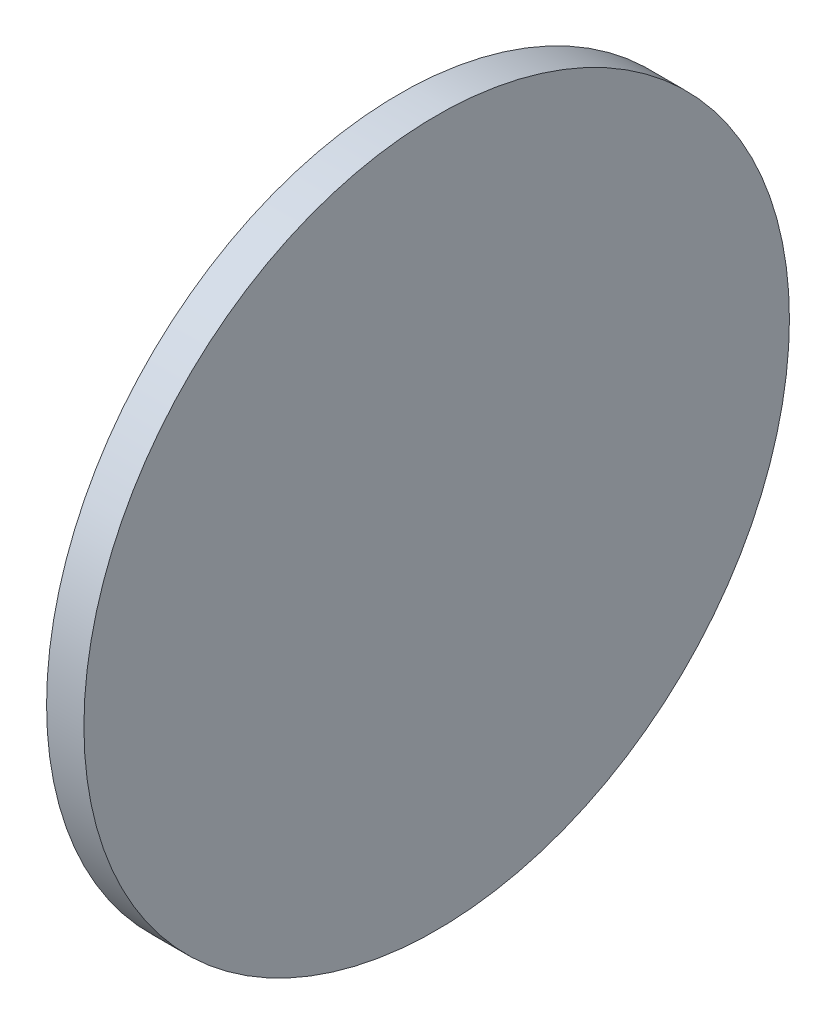
ISO-10303-21;
HEADER;
FILE_DESCRIPTION(('STEP AP214'),'2;1');
FILE_NAME('part.step','',(''),(''),'','','');
FILE_SCHEMA(('AUTOMOTIVE_DESIGN { 1 0 10303 214 1 1 1 1 }'));
ENDSEC;
DATA;
#1=APPLICATION_CONTEXT('core data for automotive mechanical design processes');
#2=APPLICATION_PROTOCOL_DEFINITION('international standard','automotive_design',2000,#1);
#3=PRODUCT_CONTEXT('',#1,'mechanical');
#4=PRODUCT('Part','Part','',(#3));
#5=PRODUCT_RELATED_PRODUCT_CATEGORY('part','',(#4));
#6=PRODUCT_DEFINITION_FORMATION('','',#4);
#7=PRODUCT_DEFINITION_CONTEXT('part definition',#1,'design');
#8=PRODUCT_DEFINITION('design','',#6,#7);
#9=PRODUCT_DEFINITION_SHAPE('','',#8);
#10=(LENGTH_UNIT() NAMED_UNIT(*) SI_UNIT(.MILLI.,.METRE.));
#11=(NAMED_UNIT(*) PLANE_ANGLE_UNIT() SI_UNIT($,.RADIAN.));
#12=(NAMED_UNIT(*) SI_UNIT($,.STERADIAN.) SOLID_ANGLE_UNIT());
#13=UNCERTAINTY_MEASURE_WITH_UNIT(LENGTH_MEASURE(1.E-05),#10,'distance_accuracy_value','');
#14=(GEOMETRIC_REPRESENTATION_CONTEXT(3) GLOBAL_UNCERTAINTY_ASSIGNED_CONTEXT((#13)) GLOBAL_UNIT_ASSIGNED_CONTEXT((#10,
#11,#12)) REPRESENTATION_CONTEXT('',''));
#15=CARTESIAN_POINT('',(0.,0.,0.));
#16=DIRECTION('',(0.,0.,1.));
#17=DIRECTION('',(1.,0.,0.));
#18=AXIS2_PLACEMENT_3D('',#15,#16,#17);
#19=CARTESIAN_POINT('',(3.175,2.663866039953,1.77591069330199));
#20=DIRECTION('',(-1.,0.,0.));
#21=DIRECTION('',(0.,0.,1.));
#22=AXIS2_PLACEMENT_3D('',#19,#20,#21);
#23=CYLINDRICAL_SURFACE('',#22,30.);
#24=CARTESIAN_POINT('',(3.175,2.663866039953,1.77591069330199));
#25=DIRECTION('',(1.,0.,0.));
#26=DIRECTION('',(0.,0.,-1.));
#27=AXIS2_PLACEMENT_3D('',#24,#25,#26);
#28=CIRCLE('',#27,30.);
#29=CARTESIAN_POINT('',(3.175,2.663866039953,-28.224089306698));
#30=VERTEX_POINT('',#29);
#31=EDGE_CURVE('E10',#30,#30,#28,.T.);
#32=ORIENTED_EDGE('',*,*,#31,.F.);
#33=EDGE_LOOP('',(#32));
#34=FACE_BOUND('',#33,.T.);
#35=CARTESIAN_POINT('',(0.,2.663866039953,1.77591069330199));
#36=DIRECTION('',(1.,0.,0.));
#37=DIRECTION('',(0.,0.,-1.));
#38=AXIS2_PLACEMENT_3D('',#35,#36,#37);
#39=CIRCLE('',#38,30.);
#40=CARTESIAN_POINT('',(0.,2.663866039953,-28.224089306698));
#41=VERTEX_POINT('',#40);
#42=EDGE_CURVE('E32',#41,#41,#39,.T.);
#43=ORIENTED_EDGE('',*,*,#42,.T.);
#44=EDGE_LOOP('',(#43));
#45=FACE_BOUND('',#44,.T.);
#46=ADVANCED_FACE('F29',(#34,#45),#23,.T.);
#47=CARTESIAN_POINT('',(3.175,2.663866039953,1.77591069330199));
#48=DIRECTION('',(1.,0.,0.));
#49=DIRECTION('',(0.,0.,-1.));
#50=AXIS2_PLACEMENT_3D('',#47,#48,#49);
#51=PLANE('',#50);
#52=ORIENTED_EDGE('',*,*,#31,.T.);
#53=EDGE_LOOP('',(#52));
#54=FACE_BOUND('',#53,.T.);
#55=ADVANCED_FACE('F44',(#54),#51,.T.);
#56=CARTESIAN_POINT('',(0.,2.663866039953,1.77591069330199));
#57=DIRECTION('',(1.,0.,0.));
#58=DIRECTION('',(0.,0.,-1.));
#59=AXIS2_PLACEMENT_3D('',#56,#57,#58);
#60=PLANE('',#59);
#61=ORIENTED_EDGE('',*,*,#42,.F.);
#62=EDGE_LOOP('',(#61));
#63=FACE_BOUND('',#62,.T.);
#64=ADVANCED_FACE('F42',(#63),#60,.F.);
#65=CLOSED_SHELL('',(#46,#55,#64));
#66=MANIFOLD_SOLID_BREP('B2',#65);
#67=ADVANCED_BREP_SHAPE_REPRESENTATION('',(#18,#66),#14);
#68=SHAPE_DEFINITION_REPRESENTATION(#9,#67);
ENDSEC;
END-ISO-10303-21;
